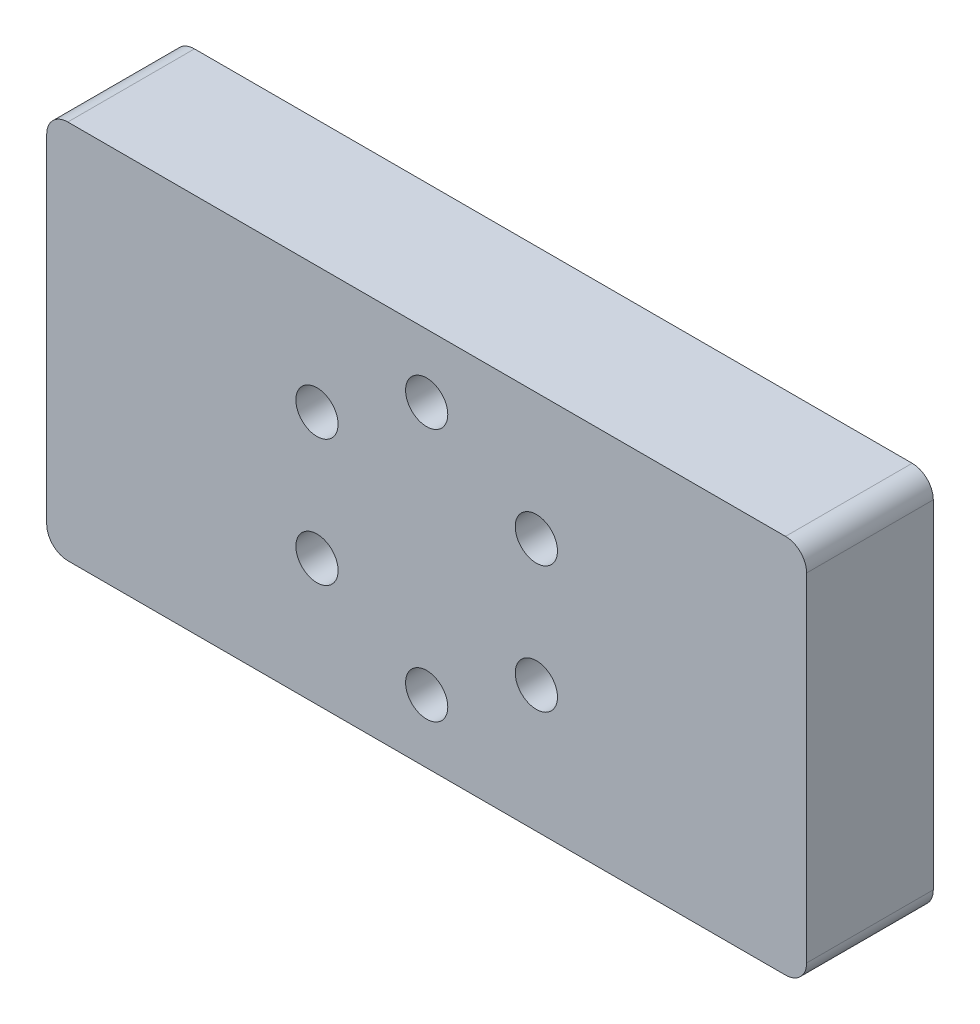
ISO-10303-21;
HEADER;
FILE_DESCRIPTION(('STEP AP214'),'2;1');
FILE_NAME('part.step','',(''),(''),'','','');
FILE_SCHEMA(('AUTOMOTIVE_DESIGN { 1 0 10303 214 1 1 1 1 }'));
ENDSEC;
DATA;
#1=APPLICATION_CONTEXT('core data for automotive mechanical design processes');
#2=APPLICATION_PROTOCOL_DEFINITION('international standard','automotive_design',2000,#1);
#3=PRODUCT_CONTEXT('',#1,'mechanical');
#4=PRODUCT('Part','Part','',(#3));
#5=PRODUCT_RELATED_PRODUCT_CATEGORY('part','',(#4));
#6=PRODUCT_DEFINITION_FORMATION('','',#4);
#7=PRODUCT_DEFINITION_CONTEXT('part definition',#1,'design');
#8=PRODUCT_DEFINITION('design','',#6,#7);
#9=PRODUCT_DEFINITION_SHAPE('','',#8);
#10=(LENGTH_UNIT() NAMED_UNIT(*) SI_UNIT(.MILLI.,.METRE.));
#11=(NAMED_UNIT(*) PLANE_ANGLE_UNIT() SI_UNIT($,.RADIAN.));
#12=(NAMED_UNIT(*) SI_UNIT($,.STERADIAN.) SOLID_ANGLE_UNIT());
#13=UNCERTAINTY_MEASURE_WITH_UNIT(LENGTH_MEASURE(1.E-05),#10,'distance_accuracy_value','');
#14=(GEOMETRIC_REPRESENTATION_CONTEXT(3) GLOBAL_UNCERTAINTY_ASSIGNED_CONTEXT((#13)) GLOBAL_UNIT_ASSIGNED_CONTEXT((#10,
#11,#12)) REPRESENTATION_CONTEXT('',''));
#15=CARTESIAN_POINT('',(0.,0.,0.));
#16=DIRECTION('',(0.,0.,1.));
#17=DIRECTION('',(1.,0.,0.));
#18=AXIS2_PLACEMENT_3D('',#15,#16,#17);
#19=CARTESIAN_POINT('',(85.,40.,30.));
#20=DIRECTION('',(0.,0.,-1.));
#21=DIRECTION('',(-1.,0.,0.));
#22=AXIS2_PLACEMENT_3D('',#19,#20,#21);
#23=CYLINDRICAL_SURFACE('',#22,5.);
#24=CARTESIAN_POINT('',(85.,40.,0.));
#25=DIRECTION('',(0.,0.,1.));
#26=DIRECTION('',(-1.,0.,0.));
#27=AXIS2_PLACEMENT_3D('',#24,#25,#26);
#28=CIRCLE('',#27,5.);
#29=CARTESIAN_POINT('',(90.,40.,0.));
#30=VERTEX_POINT('',#29);
#31=CARTESIAN_POINT('',(85.,45.,0.));
#32=VERTEX_POINT('',#31);
#33=EDGE_CURVE('E133',#30,#32,#28,.T.);
#34=ORIENTED_EDGE('',*,*,#33,.T.);
#35=DIRECTION('',(0.,0.,-1.));
#36=VECTOR('',#35,1.);
#37=CARTESIAN_POINT('',(85.,45.,30.));
#38=LINE('',#37,#36);
#39=CARTESIAN_POINT('',(85.,45.,30.));
#40=VERTEX_POINT('',#39);
#41=EDGE_CURVE('E11',#40,#32,#38,.T.);
#42=ORIENTED_EDGE('',*,*,#41,.F.);
#43=CARTESIAN_POINT('',(85.,40.,30.));
#44=DIRECTION('',(0.,0.,1.));
#45=DIRECTION('',(-1.,0.,0.));
#46=AXIS2_PLACEMENT_3D('',#43,#44,#45);
#47=CIRCLE('',#46,5.);
#48=CARTESIAN_POINT('',(90.,40.,30.));
#49=VERTEX_POINT('',#48);
#50=EDGE_CURVE('E148',#49,#40,#47,.T.);
#51=ORIENTED_EDGE('',*,*,#50,.F.);
#52=DIRECTION('',(0.,0.,-1.));
#53=VECTOR('',#52,1.);
#54=CARTESIAN_POINT('',(90.,40.,30.));
#55=LINE('',#54,#53);
#56=EDGE_CURVE('E129',#49,#30,#55,.T.);
#57=ORIENTED_EDGE('',*,*,#56,.T.);
#58=EDGE_LOOP('',(#34,#42,#51,#57));
#59=FACE_BOUND('',#58,.T.);
#60=ADVANCED_FACE('F37',(#59),#23,.T.);
#61=CARTESIAN_POINT('',(-85.,45.,30.));
#62=DIRECTION('',(0.,-1.,0.));
#63=DIRECTION('',(0.,0.,-1.));
#64=AXIS2_PLACEMENT_3D('',#61,#62,#63);
#65=PLANE('',#64);
#66=DIRECTION('',(-1.,0.,0.));
#67=VECTOR('',#66,1.);
#68=CARTESIAN_POINT('',(-85.,45.,0.));
#69=LINE('',#68,#67);
#70=CARTESIAN_POINT('',(-85.,45.,0.));
#71=VERTEX_POINT('',#70);
#72=EDGE_CURVE('E136',#32,#71,#69,.T.);
#73=ORIENTED_EDGE('',*,*,#72,.T.);
#74=DIRECTION('',(0.,0.,-1.));
#75=VECTOR('',#74,1.);
#76=CARTESIAN_POINT('',(-85.,45.,30.));
#77=LINE('',#76,#75);
#78=CARTESIAN_POINT('',(-85.,45.,30.));
#79=VERTEX_POINT('',#78);
#80=EDGE_CURVE('E45',#79,#71,#77,.T.);
#81=ORIENTED_EDGE('',*,*,#80,.F.);
#82=DIRECTION('',(-1.,0.,0.));
#83=VECTOR('',#82,1.);
#84=CARTESIAN_POINT('',(-85.,45.,30.));
#85=LINE('',#84,#83);
#86=EDGE_CURVE('E96',#40,#79,#85,.T.);
#87=ORIENTED_EDGE('',*,*,#86,.F.);
#88=ORIENTED_EDGE('',*,*,#41,.T.);
#89=EDGE_LOOP('',(#73,#81,#87,#88));
#90=FACE_BOUND('',#89,.T.);
#91=ADVANCED_FACE('F256',(#90),#65,.F.);
#92=CARTESIAN_POINT('',(-85.,40.,30.));
#93=DIRECTION('',(0.,0.,-1.));
#94=DIRECTION('',(-1.,0.,0.));
#95=AXIS2_PLACEMENT_3D('',#92,#93,#94);
#96=CYLINDRICAL_SURFACE('',#95,5.);
#97=CARTESIAN_POINT('',(-85.,40.,0.));
#98=DIRECTION('',(0.,0.,1.));
#99=DIRECTION('',(-1.,0.,0.));
#100=AXIS2_PLACEMENT_3D('',#97,#98,#99);
#101=CIRCLE('',#100,5.);
#102=CARTESIAN_POINT('',(-90.,40.,0.));
#103=VERTEX_POINT('',#102);
#104=EDGE_CURVE('E139',#71,#103,#101,.T.);
#105=ORIENTED_EDGE('',*,*,#104,.T.);
#106=DIRECTION('',(0.,0.,-1.));
#107=VECTOR('',#106,1.);
#108=CARTESIAN_POINT('',(-90.,40.,30.));
#109=LINE('',#108,#107);
#110=CARTESIAN_POINT('',(-90.,40.,30.));
#111=VERTEX_POINT('',#110);
#112=EDGE_CURVE('E155',#111,#103,#109,.T.);
#113=ORIENTED_EDGE('',*,*,#112,.F.);
#114=CARTESIAN_POINT('',(-85.,40.,30.));
#115=DIRECTION('',(0.,0.,1.));
#116=DIRECTION('',(-1.,0.,0.));
#117=AXIS2_PLACEMENT_3D('',#114,#115,#116);
#118=CIRCLE('',#117,5.);
#119=EDGE_CURVE('E163',#79,#111,#118,.T.);
#120=ORIENTED_EDGE('',*,*,#119,.F.);
#121=ORIENTED_EDGE('',*,*,#80,.T.);
#122=EDGE_LOOP('',(#105,#113,#120,#121));
#123=FACE_BOUND('',#122,.T.);
#124=ADVANCED_FACE('F161',(#123),#96,.T.);
#125=CARTESIAN_POINT('',(-90.,-40.,30.));
#126=DIRECTION('',(1.,0.,0.));
#127=DIRECTION('',(0.,0.,-1.));
#128=AXIS2_PLACEMENT_3D('',#125,#126,#127);
#129=PLANE('',#128);
#130=DIRECTION('',(0.,-1.,0.));
#131=VECTOR('',#130,1.);
#132=CARTESIAN_POINT('',(-90.,-40.,0.));
#133=LINE('',#132,#131);
#134=CARTESIAN_POINT('',(-90.,-40.,0.));
#135=VERTEX_POINT('',#134);
#136=EDGE_CURVE('E141',#103,#135,#133,.T.);
#137=ORIENTED_EDGE('',*,*,#136,.T.);
#138=DIRECTION('',(0.,0.,-1.));
#139=VECTOR('',#138,1.);
#140=CARTESIAN_POINT('',(-90.,-40.,30.));
#141=LINE('',#140,#139);
#142=CARTESIAN_POINT('',(-90.,-40.,30.));
#143=VERTEX_POINT('',#142);
#144=EDGE_CURVE('E152',#143,#135,#141,.T.);
#145=ORIENTED_EDGE('',*,*,#144,.F.);
#146=DIRECTION('',(0.,-1.,0.));
#147=VECTOR('',#146,1.);
#148=CARTESIAN_POINT('',(-90.,-40.,30.));
#149=LINE('',#148,#147);
#150=EDGE_CURVE('E175',#111,#143,#149,.T.);
#151=ORIENTED_EDGE('',*,*,#150,.F.);
#152=ORIENTED_EDGE('',*,*,#112,.T.);
#153=EDGE_LOOP('',(#137,#145,#151,#152));
#154=FACE_BOUND('',#153,.T.);
#155=ADVANCED_FACE('F171',(#154),#129,.F.);
#156=CARTESIAN_POINT('',(-85.,-40.,30.));
#157=DIRECTION('',(0.,0.,-1.));
#158=DIRECTION('',(-1.,0.,0.));
#159=AXIS2_PLACEMENT_3D('',#156,#157,#158);
#160=CYLINDRICAL_SURFACE('',#159,5.);
#161=CARTESIAN_POINT('',(-85.,-40.,0.));
#162=DIRECTION('',(0.,0.,1.));
#163=DIRECTION('',(-1.,0.,0.));
#164=AXIS2_PLACEMENT_3D('',#161,#162,#163);
#165=CIRCLE('',#164,5.);
#166=CARTESIAN_POINT('',(-85.,-45.,0.));
#167=VERTEX_POINT('',#166);
#168=EDGE_CURVE('E143',#135,#167,#165,.T.);
#169=ORIENTED_EDGE('',*,*,#168,.T.);
#170=DIRECTION('',(0.,0.,-1.));
#171=VECTOR('',#170,1.);
#172=CARTESIAN_POINT('',(-85.,-45.,30.));
#173=LINE('',#172,#171);
#174=CARTESIAN_POINT('',(-85.,-45.,30.));
#175=VERTEX_POINT('',#174);
#176=EDGE_CURVE('E124',#175,#167,#173,.T.);
#177=ORIENTED_EDGE('',*,*,#176,.F.);
#178=CARTESIAN_POINT('',(-85.,-40.,30.));
#179=DIRECTION('',(0.,0.,1.));
#180=DIRECTION('',(-1.,0.,0.));
#181=AXIS2_PLACEMENT_3D('',#178,#179,#180);
#182=CIRCLE('',#181,5.);
#183=EDGE_CURVE('E115',#143,#175,#182,.T.);
#184=ORIENTED_EDGE('',*,*,#183,.F.);
#185=ORIENTED_EDGE('',*,*,#144,.T.);
#186=EDGE_LOOP('',(#169,#177,#184,#185));
#187=FACE_BOUND('',#186,.T.);
#188=ADVANCED_FACE('F174',(#187),#160,.T.);
#189=CARTESIAN_POINT('',(-85.,-45.,30.));
#190=DIRECTION('',(0.,1.,0.));
#191=DIRECTION('',(0.,0.,1.));
#192=AXIS2_PLACEMENT_3D('',#189,#190,#191);
#193=PLANE('',#192);
#194=DIRECTION('',(1.,0.,0.));
#195=VECTOR('',#194,1.);
#196=CARTESIAN_POINT('',(-85.,-45.,0.));
#197=LINE('',#196,#195);
#198=CARTESIAN_POINT('',(85.,-45.,0.));
#199=VERTEX_POINT('',#198);
#200=EDGE_CURVE('E123',#167,#199,#197,.T.);
#201=ORIENTED_EDGE('',*,*,#200,.T.);
#202=DIRECTION('',(0.,0.,-1.));
#203=VECTOR('',#202,1.);
#204=CARTESIAN_POINT('',(85.,-45.,30.));
#205=LINE('',#204,#203);
#206=CARTESIAN_POINT('',(85.,-45.,30.));
#207=VERTEX_POINT('',#206);
#208=EDGE_CURVE('E120',#207,#199,#205,.T.);
#209=ORIENTED_EDGE('',*,*,#208,.F.);
#210=DIRECTION('',(1.,0.,0.));
#211=VECTOR('',#210,1.);
#212=CARTESIAN_POINT('',(-85.,-45.,30.));
#213=LINE('',#212,#211);
#214=EDGE_CURVE('E109',#175,#207,#213,.T.);
#215=ORIENTED_EDGE('',*,*,#214,.F.);
#216=ORIENTED_EDGE('',*,*,#176,.T.);
#217=EDGE_LOOP('',(#201,#209,#215,#216));
#218=FACE_BOUND('',#217,.T.);
#219=ADVANCED_FACE('F121',(#218),#193,.F.);
#220=CARTESIAN_POINT('',(85.,-40.,30.));
#221=DIRECTION('',(0.,0.,-1.));
#222=DIRECTION('',(-1.,0.,0.));
#223=AXIS2_PLACEMENT_3D('',#220,#221,#222);
#224=CYLINDRICAL_SURFACE('',#223,5.);
#225=CARTESIAN_POINT('',(85.,-40.,0.));
#226=DIRECTION('',(0.,0.,1.));
#227=DIRECTION('',(1.,0.,0.));
#228=AXIS2_PLACEMENT_3D('',#225,#226,#227);
#229=CIRCLE('',#228,5.);
#230=CARTESIAN_POINT('',(90.,-40.,0.));
#231=VERTEX_POINT('',#230);
#232=EDGE_CURVE('E82',#199,#231,#229,.T.);
#233=ORIENTED_EDGE('',*,*,#232,.T.);
#234=DIRECTION('',(0.,0.,-1.));
#235=VECTOR('',#234,1.);
#236=CARTESIAN_POINT('',(90.,-40.,30.));
#237=LINE('',#236,#235);
#238=CARTESIAN_POINT('',(90.,-40.,30.));
#239=VERTEX_POINT('',#238);
#240=EDGE_CURVE('E125',#239,#231,#237,.T.);
#241=ORIENTED_EDGE('',*,*,#240,.F.);
#242=CARTESIAN_POINT('',(85.,-40.,30.));
#243=DIRECTION('',(0.,0.,1.));
#244=DIRECTION('',(1.,0.,0.));
#245=AXIS2_PLACEMENT_3D('',#242,#243,#244);
#246=CIRCLE('',#245,5.);
#247=EDGE_CURVE('E113',#207,#239,#246,.T.);
#248=ORIENTED_EDGE('',*,*,#247,.F.);
#249=ORIENTED_EDGE('',*,*,#208,.T.);
#250=EDGE_LOOP('',(#233,#241,#248,#249));
#251=FACE_BOUND('',#250,.T.);
#252=ADVANCED_FACE('F127',(#251),#224,.T.);
#253=CARTESIAN_POINT('',(90.,-40.,30.));
#254=DIRECTION('',(-1.,0.,0.));
#255=DIRECTION('',(0.,0.,1.));
#256=AXIS2_PLACEMENT_3D('',#253,#254,#255);
#257=PLANE('',#256);
#258=DIRECTION('',(0.,1.,0.));
#259=VECTOR('',#258,1.);
#260=CARTESIAN_POINT('',(90.,-40.,0.));
#261=LINE('',#260,#259);
#262=EDGE_CURVE('E88',#231,#30,#261,.T.);
#263=ORIENTED_EDGE('',*,*,#262,.T.);
#264=ORIENTED_EDGE('',*,*,#56,.F.);
#265=DIRECTION('',(0.,1.,0.));
#266=VECTOR('',#265,1.);
#267=CARTESIAN_POINT('',(90.,-40.,30.));
#268=LINE('',#267,#266);
#269=EDGE_CURVE('E53',#239,#49,#268,.T.);
#270=ORIENTED_EDGE('',*,*,#269,.F.);
#271=ORIENTED_EDGE('',*,*,#240,.T.);
#272=EDGE_LOOP('',(#263,#264,#270,#271));
#273=FACE_BOUND('',#272,.T.);
#274=ADVANCED_FACE('F228',(#273),#257,.F.);
#275=CARTESIAN_POINT('',(85.,40.,30.));
#276=DIRECTION('',(0.,0.,-1.));
#277=DIRECTION('',(-1.,0.,0.));
#278=AXIS2_PLACEMENT_3D('',#275,#276,#277);
#279=PLANE('',#278);
#280=CARTESIAN_POINT('',(0.,30.,30.));
#281=DIRECTION('',(0.,0.,1.));
#282=DIRECTION('',(1.,0.,0.));
#283=AXIS2_PLACEMENT_3D('',#280,#281,#282);
#284=CIRCLE('',#283,5.);
#285=CARTESIAN_POINT('',(5.,30.,30.));
#286=VERTEX_POINT('',#285);
#287=EDGE_CURVE('E206',#286,#286,#284,.T.);
#288=ORIENTED_EDGE('',*,*,#287,.F.);
#289=EDGE_LOOP('',(#288));
#290=FACE_BOUND('',#289,.T.);
#291=CARTESIAN_POINT('',(-25.9807621135325,14.9999999999989,30.));
#292=DIRECTION('',(0.,0.,1.));
#293=DIRECTION('',(1.,0.,0.));
#294=AXIS2_PLACEMENT_3D('',#291,#292,#293);
#295=CIRCLE('',#294,5.00000000000129);
#296=CARTESIAN_POINT('',(-20.9807621135312,14.9999999999989,30.));
#297=VERTEX_POINT('',#296);
#298=EDGE_CURVE('E207',#297,#297,#295,.T.);
#299=ORIENTED_EDGE('',*,*,#298,.F.);
#300=EDGE_LOOP('',(#299));
#301=FACE_BOUND('',#300,.T.);
#302=CARTESIAN_POINT('',(-25.9807621135312,-15.0000000000011,30.));
#303=DIRECTION('',(0.,0.,1.));
#304=DIRECTION('',(1.,0.,0.));
#305=AXIS2_PLACEMENT_3D('',#302,#303,#304);
#306=CIRCLE('',#305,5.00000000000243);
#307=CARTESIAN_POINT('',(-20.9807621135288,-15.0000000000011,30.));
#308=VERTEX_POINT('',#307);
#309=EDGE_CURVE('E181',#308,#308,#306,.T.);
#310=ORIENTED_EDGE('',*,*,#309,.F.);
#311=EDGE_LOOP('',(#310));
#312=FACE_BOUND('',#311,.T.);
#313=CARTESIAN_POINT('',(2.55060596794148E-12,-30.,30.));
#314=DIRECTION('',(0.,0.,1.));
#315=DIRECTION('',(1.,0.,0.));
#316=AXIS2_PLACEMENT_3D('',#313,#314,#315);
#317=CIRCLE('',#316,5.00000000000264);
#318=CARTESIAN_POINT('',(5.00000000000519,-30.,30.));
#319=VERTEX_POINT('',#318);
#320=EDGE_CURVE('E188',#319,#319,#317,.T.);
#321=ORIENTED_EDGE('',*,*,#320,.F.);
#322=EDGE_LOOP('',(#321));
#323=FACE_BOUND('',#322,.T.);
#324=CARTESIAN_POINT('',(25.9807621135351,-14.9999999999989,30.));
#325=DIRECTION('',(0.,0.,1.));
#326=DIRECTION('',(1.,0.,0.));
#327=AXIS2_PLACEMENT_3D('',#324,#325,#326);
#328=CIRCLE('',#327,5.00000000000164);
#329=CARTESIAN_POINT('',(30.9807621135367,-14.9999999999989,30.));
#330=VERTEX_POINT('',#329);
#331=EDGE_CURVE('E194',#330,#330,#328,.T.);
#332=ORIENTED_EDGE('',*,*,#331,.F.);
#333=EDGE_LOOP('',(#332));
#334=FACE_BOUND('',#333,.T.);
#335=CARTESIAN_POINT('',(25.9807621135338,15.0000000000011,30.));
#336=DIRECTION('',(0.,0.,1.));
#337=DIRECTION('',(1.,0.,0.));
#338=AXIS2_PLACEMENT_3D('',#335,#336,#337);
#339=CIRCLE('',#338,5.00000000000036);
#340=CARTESIAN_POINT('',(30.9807621135342,15.0000000000011,30.));
#341=VERTEX_POINT('',#340);
#342=EDGE_CURVE('E200',#341,#341,#339,.T.);
#343=ORIENTED_EDGE('',*,*,#342,.F.);
#344=EDGE_LOOP('',(#343));
#345=FACE_BOUND('',#344,.T.);
#346=ORIENTED_EDGE('',*,*,#50,.T.);
#347=ORIENTED_EDGE('',*,*,#86,.T.);
#348=ORIENTED_EDGE('',*,*,#119,.T.);
#349=ORIENTED_EDGE('',*,*,#150,.T.);
#350=ORIENTED_EDGE('',*,*,#183,.T.);
#351=ORIENTED_EDGE('',*,*,#214,.T.);
#352=ORIENTED_EDGE('',*,*,#247,.T.);
#353=ORIENTED_EDGE('',*,*,#269,.T.);
#354=EDGE_LOOP('',(#346,#347,#348,#349,#350,#351,#352,#353));
#355=FACE_BOUND('',#354,.T.);
#356=ADVANCED_FACE('F111',(#290,#301,#312,#323,#334,#345,#355),#279,.F.);
#357=CARTESIAN_POINT('',(85.,40.,0.));
#358=DIRECTION('',(0.,0.,-1.));
#359=DIRECTION('',(-1.,0.,0.));
#360=AXIS2_PLACEMENT_3D('',#357,#358,#359);
#361=PLANE('',#360);
#362=CARTESIAN_POINT('',(0.,30.,0.));
#363=DIRECTION('',(0.,0.,1.));
#364=DIRECTION('',(1.,0.,0.));
#365=AXIS2_PLACEMENT_3D('',#362,#363,#364);
#366=CIRCLE('',#365,5.);
#367=CARTESIAN_POINT('',(5.,30.,0.));
#368=VERTEX_POINT('',#367);
#369=EDGE_CURVE('E137',#368,#368,#366,.T.);
#370=ORIENTED_EDGE('',*,*,#369,.T.);
#371=EDGE_LOOP('',(#370));
#372=FACE_BOUND('',#371,.T.);
#373=CARTESIAN_POINT('',(-25.9807621135325,14.9999999999989,0.));
#374=DIRECTION('',(0.,0.,1.));
#375=DIRECTION('',(1.,0.,0.));
#376=AXIS2_PLACEMENT_3D('',#373,#374,#375);
#377=CIRCLE('',#376,5.00000000000129);
#378=CARTESIAN_POINT('',(-20.9807621135312,14.9999999999989,0.));
#379=VERTEX_POINT('',#378);
#380=EDGE_CURVE('E185',#379,#379,#377,.T.);
#381=ORIENTED_EDGE('',*,*,#380,.T.);
#382=EDGE_LOOP('',(#381));
#383=FACE_BOUND('',#382,.T.);
#384=CARTESIAN_POINT('',(-25.9807621135312,-15.0000000000011,0.));
#385=DIRECTION('',(0.,0.,1.));
#386=DIRECTION('',(1.,0.,0.));
#387=AXIS2_PLACEMENT_3D('',#384,#385,#386);
#388=CIRCLE('',#387,5.00000000000243);
#389=CARTESIAN_POINT('',(-20.9807621135288,-15.0000000000011,0.));
#390=VERTEX_POINT('',#389);
#391=EDGE_CURVE('E184',#390,#390,#388,.T.);
#392=ORIENTED_EDGE('',*,*,#391,.T.);
#393=EDGE_LOOP('',(#392));
#394=FACE_BOUND('',#393,.T.);
#395=CARTESIAN_POINT('',(2.55060596794148E-12,-30.,0.));
#396=DIRECTION('',(0.,0.,1.));
#397=DIRECTION('',(1.,0.,0.));
#398=AXIS2_PLACEMENT_3D('',#395,#396,#397);
#399=CIRCLE('',#398,5.00000000000264);
#400=CARTESIAN_POINT('',(5.00000000000519,-30.,0.));
#401=VERTEX_POINT('',#400);
#402=EDGE_CURVE('E191',#401,#401,#399,.T.);
#403=ORIENTED_EDGE('',*,*,#402,.T.);
#404=EDGE_LOOP('',(#403));
#405=FACE_BOUND('',#404,.T.);
#406=CARTESIAN_POINT('',(25.9807621135351,-14.9999999999989,0.));
#407=DIRECTION('',(0.,0.,1.));
#408=DIRECTION('',(1.,0.,0.));
#409=AXIS2_PLACEMENT_3D('',#406,#407,#408);
#410=CIRCLE('',#409,5.00000000000164);
#411=CARTESIAN_POINT('',(30.9807621135367,-14.9999999999989,0.));
#412=VERTEX_POINT('',#411);
#413=EDGE_CURVE('E197',#412,#412,#410,.T.);
#414=ORIENTED_EDGE('',*,*,#413,.T.);
#415=EDGE_LOOP('',(#414));
#416=FACE_BOUND('',#415,.T.);
#417=CARTESIAN_POINT('',(25.9807621135338,15.0000000000011,0.));
#418=DIRECTION('',(0.,0.,1.));
#419=DIRECTION('',(1.,0.,0.));
#420=AXIS2_PLACEMENT_3D('',#417,#418,#419);
#421=CIRCLE('',#420,5.00000000000036);
#422=CARTESIAN_POINT('',(30.9807621135342,15.0000000000011,0.));
#423=VERTEX_POINT('',#422);
#424=EDGE_CURVE('E203',#423,#423,#421,.T.);
#425=ORIENTED_EDGE('',*,*,#424,.T.);
#426=EDGE_LOOP('',(#425));
#427=FACE_BOUND('',#426,.T.);
#428=ORIENTED_EDGE('',*,*,#33,.F.);
#429=ORIENTED_EDGE('',*,*,#262,.F.);
#430=ORIENTED_EDGE('',*,*,#232,.F.);
#431=ORIENTED_EDGE('',*,*,#200,.F.);
#432=ORIENTED_EDGE('',*,*,#168,.F.);
#433=ORIENTED_EDGE('',*,*,#136,.F.);
#434=ORIENTED_EDGE('',*,*,#104,.F.);
#435=ORIENTED_EDGE('',*,*,#72,.F.);
#436=EDGE_LOOP('',(#428,#429,#430,#431,#432,#433,#434,#435));
#437=FACE_BOUND('',#436,.T.);
#438=ADVANCED_FACE('F167',(#372,#383,#394,#405,#416,#427,#437),#361,.T.);
#439=CARTESIAN_POINT('',(25.9807621135338,15.0000000000011,0.));
#440=DIRECTION('',(0.,0.,1.));
#441=DIRECTION('',(1.,0.,0.));
#442=AXIS2_PLACEMENT_3D('',#439,#440,#441);
#443=CYLINDRICAL_SURFACE('',#442,5.00000000000036);
#444=ORIENTED_EDGE('',*,*,#424,.F.);
#445=EDGE_LOOP('',(#444));
#446=FACE_BOUND('',#445,.T.);
#447=ORIENTED_EDGE('',*,*,#342,.T.);
#448=EDGE_LOOP('',(#447));
#449=FACE_BOUND('',#448,.T.);
#450=ADVANCED_FACE('F240',(#446,#449),#443,.F.);
#451=CARTESIAN_POINT('',(25.9807621135351,-14.9999999999989,0.));
#452=DIRECTION('',(0.,0.,1.));
#453=DIRECTION('',(1.,0.,0.));
#454=AXIS2_PLACEMENT_3D('',#451,#452,#453);
#455=CYLINDRICAL_SURFACE('',#454,5.00000000000164);
#456=ORIENTED_EDGE('',*,*,#413,.F.);
#457=EDGE_LOOP('',(#456));
#458=FACE_BOUND('',#457,.T.);
#459=ORIENTED_EDGE('',*,*,#331,.T.);
#460=EDGE_LOOP('',(#459));
#461=FACE_BOUND('',#460,.T.);
#462=ADVANCED_FACE('F242',(#458,#461),#455,.F.);
#463=CARTESIAN_POINT('',(2.55060596794148E-12,-30.,0.));
#464=DIRECTION('',(0.,0.,1.));
#465=DIRECTION('',(1.,0.,0.));
#466=AXIS2_PLACEMENT_3D('',#463,#464,#465);
#467=CYLINDRICAL_SURFACE('',#466,5.00000000000264);
#468=ORIENTED_EDGE('',*,*,#402,.F.);
#469=EDGE_LOOP('',(#468));
#470=FACE_BOUND('',#469,.T.);
#471=ORIENTED_EDGE('',*,*,#320,.T.);
#472=EDGE_LOOP('',(#471));
#473=FACE_BOUND('',#472,.T.);
#474=ADVANCED_FACE('F249',(#470,#473),#467,.F.);
#475=CARTESIAN_POINT('',(-25.9807621135312,-15.0000000000011,0.));
#476=DIRECTION('',(0.,0.,1.));
#477=DIRECTION('',(1.,0.,0.));
#478=AXIS2_PLACEMENT_3D('',#475,#476,#477);
#479=CYLINDRICAL_SURFACE('',#478,5.00000000000243);
#480=ORIENTED_EDGE('',*,*,#391,.F.);
#481=EDGE_LOOP('',(#480));
#482=FACE_BOUND('',#481,.T.);
#483=ORIENTED_EDGE('',*,*,#309,.T.);
#484=EDGE_LOOP('',(#483));
#485=FACE_BOUND('',#484,.T.);
#486=ADVANCED_FACE('F332',(#482,#485),#479,.F.);
#487=CARTESIAN_POINT('',(-25.9807621135325,14.9999999999989,0.));
#488=DIRECTION('',(0.,0.,1.));
#489=DIRECTION('',(1.,0.,0.));
#490=AXIS2_PLACEMENT_3D('',#487,#488,#489);
#491=CYLINDRICAL_SURFACE('',#490,5.00000000000129);
#492=ORIENTED_EDGE('',*,*,#380,.F.);
#493=EDGE_LOOP('',(#492));
#494=FACE_BOUND('',#493,.T.);
#495=ORIENTED_EDGE('',*,*,#298,.T.);
#496=EDGE_LOOP('',(#495));
#497=FACE_BOUND('',#496,.T.);
#498=ADVANCED_FACE('F222',(#494,#497),#491,.F.);
#499=CARTESIAN_POINT('',(0.,30.,0.));
#500=DIRECTION('',(0.,0.,1.));
#501=DIRECTION('',(1.,0.,0.));
#502=AXIS2_PLACEMENT_3D('',#499,#500,#501);
#503=CYLINDRICAL_SURFACE('',#502,5.);
#504=ORIENTED_EDGE('',*,*,#369,.F.);
#505=EDGE_LOOP('',(#504));
#506=FACE_BOUND('',#505,.T.);
#507=ORIENTED_EDGE('',*,*,#287,.T.);
#508=EDGE_LOOP('',(#507));
#509=FACE_BOUND('',#508,.T.);
#510=ADVANCED_FACE('F219',(#506,#509),#503,.F.);
#511=CLOSED_SHELL('',(#60,#91,#124,#155,#188,#219,#252,#274,#356,#438,#450,#462,#474,#486,#498,#510));
#512=MANIFOLD_SOLID_BREP('B2',#511);
#513=ADVANCED_BREP_SHAPE_REPRESENTATION('',(#18,#512),#14);
#514=SHAPE_DEFINITION_REPRESENTATION(#9,#513);
ENDSEC;
END-ISO-10303-21;
